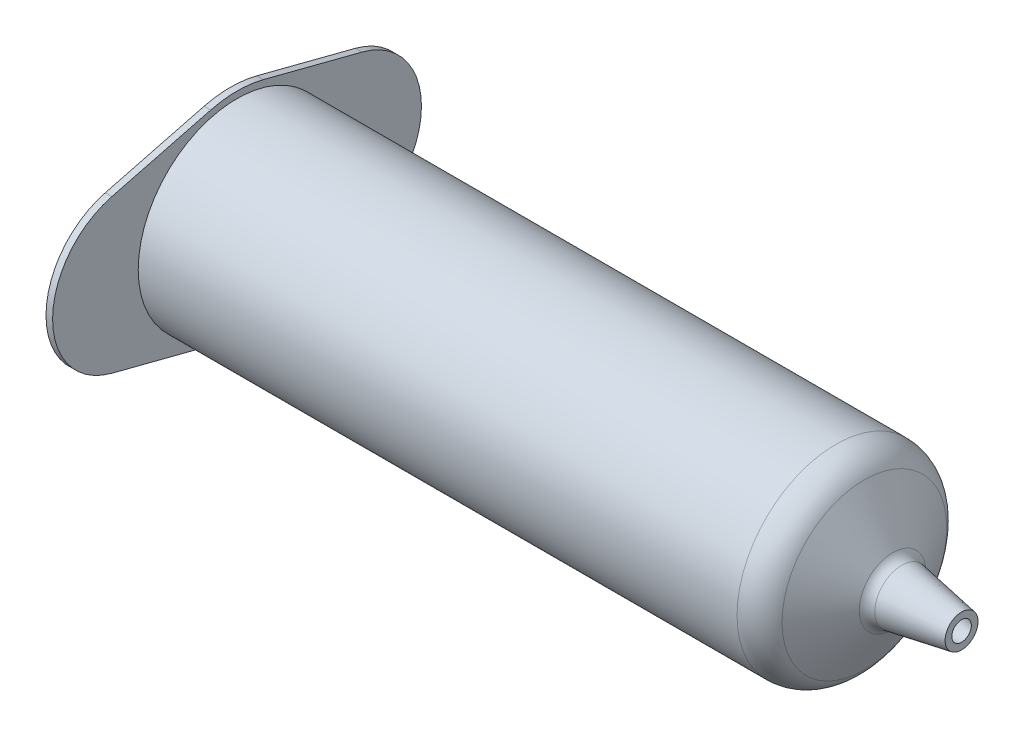
ISO-10303-21;
HEADER;
FILE_DESCRIPTION(('STEP AP214'),'2;1');
FILE_NAME('part.step','',(''),(''),'','','');
FILE_SCHEMA(('AUTOMOTIVE_DESIGN { 1 0 10303 214 1 1 1 1 }'));
ENDSEC;
DATA;
#1=APPLICATION_CONTEXT('core data for automotive mechanical design processes');
#2=APPLICATION_PROTOCOL_DEFINITION('international standard','automotive_design',2000,#1);
#3=PRODUCT_CONTEXT('',#1,'mechanical');
#4=PRODUCT('Part','Part','',(#3));
#5=PRODUCT_RELATED_PRODUCT_CATEGORY('part','',(#4));
#6=PRODUCT_DEFINITION_FORMATION('','',#4);
#7=PRODUCT_DEFINITION_CONTEXT('part definition',#1,'design');
#8=PRODUCT_DEFINITION('design','',#6,#7);
#9=PRODUCT_DEFINITION_SHAPE('','',#8);
#10=(LENGTH_UNIT() NAMED_UNIT(*) SI_UNIT(.MILLI.,.METRE.));
#11=(NAMED_UNIT(*) PLANE_ANGLE_UNIT() SI_UNIT($,.RADIAN.));
#12=(NAMED_UNIT(*) SI_UNIT($,.STERADIAN.) SOLID_ANGLE_UNIT());
#13=UNCERTAINTY_MEASURE_WITH_UNIT(LENGTH_MEASURE(1.E-05),#10,'distance_accuracy_value','');
#14=(GEOMETRIC_REPRESENTATION_CONTEXT(3) GLOBAL_UNCERTAINTY_ASSIGNED_CONTEXT((#13)) GLOBAL_UNIT_ASSIGNED_CONTEXT((#10,
#11,#12)) REPRESENTATION_CONTEXT('',''));
#15=CARTESIAN_POINT('',(0.,0.,0.));
#16=DIRECTION('',(0.,0.,1.));
#17=DIRECTION('',(1.,0.,0.));
#18=AXIS2_PLACEMENT_3D('',#15,#16,#17);
#19=CARTESIAN_POINT('',(11.5,70.,59.6966991411007));
#20=DIRECTION('',(-1.,0.,0.));
#21=DIRECTION('',(0.,0.,1.));
#22=AXIS2_PLACEMENT_3D('',#19,#20,#21);
#23=CYLINDRICAL_SURFACE('',#22,15.);
#24=CARTESIAN_POINT('',(102.414394586956,70.,59.6966991411007));
#25=DIRECTION('',(1.,0.,0.));
#26=DIRECTION('',(0.,0.,-1.));
#27=AXIS2_PLACEMENT_3D('',#24,#25,#26);
#28=CIRCLE('',#27,15.);
#29=CARTESIAN_POINT('',(102.414394586956,70.,44.6966991411007));
#30=VERTEX_POINT('',#29);
#31=EDGE_CURVE('E227',#30,#30,#28,.F.);
#32=ORIENTED_EDGE('',*,*,#31,.T.);
#33=EDGE_LOOP('',(#32));
#34=FACE_BOUND('',#33,.T.);
#35=CARTESIAN_POINT('',(11.5,70.,59.6966991411007));
#36=DIRECTION('',(-1.,0.,0.));
#37=DIRECTION('',(0.,0.,1.));
#38=AXIS2_PLACEMENT_3D('',#35,#36,#37);
#39=CIRCLE('',#38,15.);
#40=CARTESIAN_POINT('',(11.5,70.,74.6966991411007));
#41=VERTEX_POINT('',#40);
#42=EDGE_CURVE('E224',#41,#41,#39,.T.);
#43=ORIENTED_EDGE('',*,*,#42,.F.);
#44=EDGE_LOOP('',(#43));
#45=FACE_BOUND('',#44,.T.);
#46=ADVANCED_FACE('F77',(#34,#45),#23,.T.);
#47=CARTESIAN_POINT('',(111.5,70.,59.6966991411007));
#48=DIRECTION('',(-1.,0.,0.));
#49=DIRECTION('',(0.,0.,1.));
#50=AXIS2_PLACEMENT_3D('',#47,#48,#49);
#51=CONICAL_SURFACE('',#50,4.26326980708461,1.0471975511966);
#52=CARTESIAN_POINT('',(111.033692341845,70.,59.6966991411007));
#53=DIRECTION('',(-1.,0.,0.));
#54=DIRECTION('',(0.,0.,1.));
#55=AXIS2_PLACEMENT_3D('',#52,#53,#54);
#56=CIRCLE('',#55,5.07093836296753);
#57=CARTESIAN_POINT('',(111.033692341845,70.,64.7676375040682));
#58=VERTEX_POINT('',#57);
#59=EDGE_CURVE('E86',#58,#58,#56,.T.);
#60=ORIENTED_EDGE('',*,*,#59,.T.);
#61=EDGE_LOOP('',(#60));
#62=FACE_BOUND('',#61,.T.);
#63=CARTESIAN_POINT('',(106.744521605878,70.,59.6966991411007));
#64=DIRECTION('',(1.,0.,0.));
#65=DIRECTION('',(0.,0.,-1.));
#66=AXIS2_PLACEMENT_3D('',#63,#64,#65);
#67=CIRCLE('',#66,12.5);
#68=CARTESIAN_POINT('',(106.744521605878,70.,47.1966991411007));
#69=VERTEX_POINT('',#68);
#70=EDGE_CURVE('E230',#69,#69,#67,.T.);
#71=ORIENTED_EDGE('',*,*,#70,.T.);
#72=EDGE_LOOP('',(#71));
#73=FACE_BOUND('',#72,.T.);
#74=ADVANCED_FACE('F235',(#62,#73),#51,.T.);
#75=CARTESIAN_POINT('',(121.5,70.,59.6966991411007));
#76=DIRECTION('',(-1.,0.,0.));
#77=DIRECTION('',(0.,0.,1.));
#78=AXIS2_PLACEMENT_3D('',#75,#76,#77);
#79=CONICAL_SURFACE('',#78,2.5,0.174532925199429);
#80=CARTESIAN_POINT('',(112.41844679408,70.,59.6966991411007));
#81=DIRECTION('',(-1.,0.,0.));
#82=DIRECTION('',(0.,0.,1.));
#83=AXIS2_PLACEMENT_3D('',#80,#81,#82);
#84=CIRCLE('',#83,4.10132285694311);
#85=CARTESIAN_POINT('',(112.41844679408,70.,63.7980219980438));
#86=VERTEX_POINT('',#85);
#87=EDGE_CURVE('E13',#86,#86,#84,.F.);
#88=ORIENTED_EDGE('',*,*,#87,.T.);
#89=EDGE_LOOP('',(#88));
#90=FACE_BOUND('',#89,.T.);
#91=CARTESIAN_POINT('',(121.5,70.,59.6966991411007));
#92=DIRECTION('',(-1.,0.,0.));
#93=DIRECTION('',(0.,0.,1.));
#94=AXIS2_PLACEMENT_3D('',#91,#92,#93);
#95=CIRCLE('',#94,2.5);
#96=CARTESIAN_POINT('',(121.5,70.,62.1966991411007));
#97=VERTEX_POINT('',#96);
#98=EDGE_CURVE('E219',#97,#97,#95,.T.);
#99=ORIENTED_EDGE('',*,*,#98,.T.);
#100=EDGE_LOOP('',(#99));
#101=FACE_BOUND('',#100,.T.);
#102=ADVANCED_FACE('F258',(#90,#101),#79,.T.);
#103=CARTESIAN_POINT('',(121.5,72.5,59.6966991411007));
#104=DIRECTION('',(-1.,0.,0.));
#105=DIRECTION('',(0.,0.,1.));
#106=AXIS2_PLACEMENT_3D('',#103,#104,#105);
#107=PLANE('',#106);
#108=CARTESIAN_POINT('',(121.5,70.,59.6966991411007));
#109=DIRECTION('',(-1.,0.,0.));
#110=DIRECTION('',(0.,0.,1.));
#111=AXIS2_PLACEMENT_3D('',#108,#109,#110);
#112=CIRCLE('',#111,1.48457338811426);
#113=CARTESIAN_POINT('',(121.5,70.,61.1812725292149));
#114=VERTEX_POINT('',#113);
#115=EDGE_CURVE('E206',#114,#114,#112,.T.);
#116=ORIENTED_EDGE('',*,*,#115,.T.);
#117=EDGE_LOOP('',(#116));
#118=FACE_BOUND('',#117,.T.);
#119=ORIENTED_EDGE('',*,*,#98,.F.);
#120=EDGE_LOOP('',(#119));
#121=FACE_BOUND('',#120,.T.);
#122=ADVANCED_FACE('F249',(#118,#121),#107,.F.);
#123=CARTESIAN_POINT('',(102.414394586956,70.,59.6966991411007));
#124=DIRECTION('',(1.,0.,0.));
#125=DIRECTION('',(0.,0.,-1.));
#126=AXIS2_PLACEMENT_3D('',#123,#124,#125);
#127=TOROIDAL_SURFACE('',#126,10.,5.);
#128=ORIENTED_EDGE('',*,*,#70,.F.);
#129=EDGE_LOOP('',(#128));
#130=FACE_BOUND('',#129,.T.);
#131=ORIENTED_EDGE('',*,*,#31,.F.);
#132=EDGE_LOOP('',(#131));
#133=FACE_BOUND('',#132,.T.);
#134=ADVANCED_FACE('F240',(#130,#133),#127,.T.);
#135=CARTESIAN_POINT('',(112.765743149414,70.,59.6966991411007));
#136=DIRECTION('',(-1.,0.,0.));
#137=DIRECTION('',(0.,0.,1.));
#138=AXIS2_PLACEMENT_3D('',#135,#136,#137);
#139=TOROIDAL_SURFACE('',#138,6.07093836296754,2.);
#140=ORIENTED_EDGE('',*,*,#87,.F.);
#141=EDGE_LOOP('',(#140));
#142=FACE_BOUND('',#141,.T.);
#143=ORIENTED_EDGE('',*,*,#59,.F.);
#144=EDGE_LOOP('',(#143));
#145=FACE_BOUND('',#144,.T.);
#146=ADVANCED_FACE('F79',(#142,#145),#139,.F.);
#147=CARTESIAN_POINT('',(11.5,70.,59.6966991411007));
#148=DIRECTION('',(-1.,0.,0.));
#149=DIRECTION('',(0.,0.,1.));
#150=AXIS2_PLACEMENT_3D('',#147,#148,#149);
#151=CYLINDRICAL_SURFACE('',#150,14.);
#152=CARTESIAN_POINT('',(102.414394586956,70.,59.6966991411007));
#153=DIRECTION('',(-1.,0.,0.));
#154=DIRECTION('',(0.,0.,1.));
#155=AXIS2_PLACEMENT_3D('',#152,#153,#154);
#156=CIRCLE('',#155,14.);
#157=CARTESIAN_POINT('',(102.414394586956,70.,73.6966991411007));
#158=VERTEX_POINT('',#157);
#159=EDGE_CURVE('E207',#158,#158,#156,.T.);
#160=ORIENTED_EDGE('',*,*,#159,.F.);
#161=EDGE_LOOP('',(#160));
#162=FACE_BOUND('',#161,.T.);
#163=CARTESIAN_POINT('',(10.5,70.,59.6966991411007));
#164=DIRECTION('',(-1.,0.,0.));
#165=DIRECTION('',(0.,0.,1.));
#166=AXIS2_PLACEMENT_3D('',#163,#164,#165);
#167=CIRCLE('',#166,14.);
#168=CARTESIAN_POINT('',(10.5,70.,73.6966991411007));
#169=VERTEX_POINT('',#168);
#170=EDGE_CURVE('E180',#169,#169,#167,.T.);
#171=ORIENTED_EDGE('',*,*,#170,.T.);
#172=EDGE_LOOP('',(#171));
#173=FACE_BOUND('',#172,.T.);
#174=ADVANCED_FACE('F239',(#162,#173),#151,.F.);
#175=CARTESIAN_POINT('',(110.633974596216,70.,59.6966991411007));
#176=DIRECTION('',(-1.,0.,0.));
#177=DIRECTION('',(0.,0.,1.));
#178=AXIS2_PLACEMENT_3D('',#175,#176,#177);
#179=CONICAL_SURFACE('',#178,3.76326980708461,1.0471975511966);
#180=CARTESIAN_POINT('',(110.167666938061,70.,59.6966991411007));
#181=DIRECTION('',(-1.,0.,0.));
#182=DIRECTION('',(0.,0.,1.));
#183=AXIS2_PLACEMENT_3D('',#180,#181,#182);
#184=CIRCLE('',#183,4.57093836296753);
#185=CARTESIAN_POINT('',(110.167666938061,70.,64.2676375040682));
#186=VERTEX_POINT('',#185);
#187=EDGE_CURVE('E213',#186,#186,#184,.T.);
#188=ORIENTED_EDGE('',*,*,#187,.F.);
#189=EDGE_LOOP('',(#188));
#190=FACE_BOUND('',#189,.T.);
#191=CARTESIAN_POINT('',(105.878496202094,70.,59.6966991411007));
#192=DIRECTION('',(-1.,0.,0.));
#193=DIRECTION('',(0.,0.,1.));
#194=AXIS2_PLACEMENT_3D('',#191,#192,#193);
#195=CIRCLE('',#194,12.);
#196=CARTESIAN_POINT('',(105.878496202094,70.,71.6966991411007));
#197=VERTEX_POINT('',#196);
#198=EDGE_CURVE('E210',#197,#197,#195,.F.);
#199=ORIENTED_EDGE('',*,*,#198,.F.);
#200=EDGE_LOOP('',(#199));
#201=FACE_BOUND('',#200,.T.);
#202=ADVANCED_FACE('F246',(#190,#201),#179,.F.);
#203=CARTESIAN_POINT('',(121.326351822333,70.,59.6966991411007));
#204=DIRECTION('',(-1.,0.,0.));
#205=DIRECTION('',(0.,0.,1.));
#206=AXIS2_PLACEMENT_3D('',#203,#204,#205);
#207=CONICAL_SURFACE('',#206,1.51519224698779,0.174532925199429);
#208=CARTESIAN_POINT('',(112.244798616413,70.,59.6966991411007));
#209=DIRECTION('',(-1.,0.,0.));
#210=DIRECTION('',(0.,0.,1.));
#211=AXIS2_PLACEMENT_3D('',#208,#209,#210);
#212=CIRCLE('',#211,3.1165151039309);
#213=CARTESIAN_POINT('',(112.244798616413,70.,62.8132142450316));
#214=VERTEX_POINT('',#213);
#215=EDGE_CURVE('E216',#214,#214,#212,.F.);
#216=ORIENTED_EDGE('',*,*,#215,.F.);
#217=EDGE_LOOP('',(#216));
#218=FACE_BOUND('',#217,.T.);
#219=ORIENTED_EDGE('',*,*,#115,.F.);
#220=EDGE_LOOP('',(#219));
#221=FACE_BOUND('',#220,.T.);
#222=ADVANCED_FACE('F276',(#218,#221),#207,.F.);
#223=CARTESIAN_POINT('',(102.414394586956,70.,59.6966991411007));
#224=DIRECTION('',(1.,0.,0.));
#225=DIRECTION('',(0.,0.,-1.));
#226=AXIS2_PLACEMENT_3D('',#223,#224,#225);
#227=TOROIDAL_SURFACE('',#226,10.,4.);
#228=ORIENTED_EDGE('',*,*,#198,.T.);
#229=EDGE_LOOP('',(#228));
#230=FACE_BOUND('',#229,.T.);
#231=ORIENTED_EDGE('',*,*,#159,.T.);
#232=EDGE_LOOP('',(#231));
#233=FACE_BOUND('',#232,.T.);
#234=ADVANCED_FACE('F272',(#230,#233),#227,.F.);
#235=CARTESIAN_POINT('',(112.765743149414,70.,59.6966991411007));
#236=DIRECTION('',(-1.,0.,0.));
#237=DIRECTION('',(0.,0.,1.));
#238=AXIS2_PLACEMENT_3D('',#235,#236,#237);
#239=TOROIDAL_SURFACE('',#238,6.07093836296754,3.);
#240=ORIENTED_EDGE('',*,*,#215,.T.);
#241=EDGE_LOOP('',(#240));
#242=FACE_BOUND('',#241,.T.);
#243=ORIENTED_EDGE('',*,*,#187,.T.);
#244=EDGE_LOOP('',(#243));
#245=FACE_BOUND('',#244,.T.);
#246=ADVANCED_FACE('F268',(#242,#245),#239,.T.);
#247=CARTESIAN_POINT('',(11.5,70.,75.6966991411007));
#248=DIRECTION('',(-1.,0.,0.));
#249=DIRECTION('',(0.,0.,1.));
#250=AXIS2_PLACEMENT_3D('',#247,#248,#249);
#251=PLANE('',#250);
#252=CARTESIAN_POINT('',(11.5,70.,75.6966991411007));
#253=DIRECTION('',(-1.,0.,0.));
#254=DIRECTION('',(0.,0.,1.));
#255=AXIS2_PLACEMENT_3D('',#252,#253,#254);
#256=CIRCLE('',#255,12.);
#257=CARTESIAN_POINT('',(11.5,58.3810499613777,78.6966991411007));
#258=VERTEX_POINT('',#257);
#259=CARTESIAN_POINT('',(11.5,81.6189500386222,78.6966991411007));
#260=VERTEX_POINT('',#259);
#261=EDGE_CURVE('E176',#258,#260,#256,.T.);
#262=ORIENTED_EDGE('',*,*,#261,.F.);
#263=DIRECTION('',(0.,0.25,0.968245836551854));
#264=VECTOR('',#263,1.);
#265=CARTESIAN_POINT('',(11.5,54.5080666151703,63.6966991411007));
#266=LINE('',#265,#264);
#267=CARTESIAN_POINT('',(11.5,54.5080666151703,63.6966991411007));
#268=VERTEX_POINT('',#267);
#269=EDGE_CURVE('E129',#268,#258,#266,.T.);
#270=ORIENTED_EDGE('',*,*,#269,.F.);
#271=CARTESIAN_POINT('',(11.5,70.,59.6966991411007));
#272=DIRECTION('',(-1.,0.,0.));
#273=DIRECTION('',(0.,0.,-1.));
#274=AXIS2_PLACEMENT_3D('',#271,#272,#273);
#275=CIRCLE('',#274,16.);
#276=CARTESIAN_POINT('',(11.5,54.5080666151703,55.6966991411007));
#277=VERTEX_POINT('',#276);
#278=EDGE_CURVE('E123',#277,#268,#275,.T.);
#279=ORIENTED_EDGE('',*,*,#278,.F.);
#280=DIRECTION('',(0.,-0.25,0.968245836551854));
#281=VECTOR('',#280,1.);
#282=CARTESIAN_POINT('',(11.5,54.5080666151703,55.6966991411007));
#283=LINE('',#282,#281);
#284=CARTESIAN_POINT('',(11.5,58.3810499613777,40.6966991411007));
#285=VERTEX_POINT('',#284);
#286=EDGE_CURVE('E166',#285,#277,#283,.T.);
#287=ORIENTED_EDGE('',*,*,#286,.F.);
#288=CARTESIAN_POINT('',(11.5,70.,43.6966991411007));
#289=DIRECTION('',(-1.,0.,0.));
#290=DIRECTION('',(0.,0.,1.));
#291=AXIS2_PLACEMENT_3D('',#288,#289,#290);
#292=CIRCLE('',#291,12.);
#293=CARTESIAN_POINT('',(11.5,81.6189500386222,40.6966991411007));
#294=VERTEX_POINT('',#293);
#295=EDGE_CURVE('E186',#294,#285,#292,.T.);
#296=ORIENTED_EDGE('',*,*,#295,.F.);
#297=DIRECTION('',(0.,-0.25,-0.968245836551854));
#298=VECTOR('',#297,1.);
#299=CARTESIAN_POINT('',(11.5,85.4919333848297,55.6966991411007));
#300=LINE('',#299,#298);
#301=CARTESIAN_POINT('',(11.5,85.4919333848297,55.6966991411007));
#302=VERTEX_POINT('',#301);
#303=EDGE_CURVE('E184',#302,#294,#300,.T.);
#304=ORIENTED_EDGE('',*,*,#303,.F.);
#305=CARTESIAN_POINT('',(11.5,70.,59.6966991411007));
#306=DIRECTION('',(-1.,0.,0.));
#307=DIRECTION('',(0.,0.,1.));
#308=AXIS2_PLACEMENT_3D('',#305,#306,#307);
#309=CIRCLE('',#308,16.);
#310=CARTESIAN_POINT('',(11.5,85.4919333848297,63.6966991411007));
#311=VERTEX_POINT('',#310);
#312=EDGE_CURVE('E182',#311,#302,#309,.T.);
#313=ORIENTED_EDGE('',*,*,#312,.F.);
#314=DIRECTION('',(0.,0.25,-0.968245836551854));
#315=VECTOR('',#314,1.);
#316=CARTESIAN_POINT('',(11.5,85.4919333848297,63.6966991411007));
#317=LINE('',#316,#315);
#318=EDGE_CURVE('E179',#260,#311,#317,.T.);
#319=ORIENTED_EDGE('',*,*,#318,.F.);
#320=EDGE_LOOP('',(#262,#270,#279,#287,#296,#304,#313,#319));
#321=FACE_BOUND('',#320,.T.);
#322=ORIENTED_EDGE('',*,*,#42,.T.);
#323=EDGE_LOOP('',(#322));
#324=FACE_BOUND('',#323,.T.);
#325=ADVANCED_FACE('F271',(#321,#324),#251,.F.);
#326=CARTESIAN_POINT('',(10.5,70.,75.6966991411007));
#327=DIRECTION('',(-1.,0.,0.));
#328=DIRECTION('',(0.,0.,1.));
#329=AXIS2_PLACEMENT_3D('',#326,#327,#328);
#330=PLANE('',#329);
#331=CARTESIAN_POINT('',(10.5,70.,75.6966991411007));
#332=DIRECTION('',(-1.,0.,0.));
#333=DIRECTION('',(0.,0.,1.));
#334=AXIS2_PLACEMENT_3D('',#331,#332,#333);
#335=CIRCLE('',#334,12.);
#336=CARTESIAN_POINT('',(10.5,58.3810499613777,78.6966991411007));
#337=VERTEX_POINT('',#336);
#338=CARTESIAN_POINT('',(10.5,81.6189500386222,78.6966991411007));
#339=VERTEX_POINT('',#338);
#340=EDGE_CURVE('E191',#337,#339,#335,.T.);
#341=ORIENTED_EDGE('',*,*,#340,.T.);
#342=DIRECTION('',(0.,0.25,-0.968245836551854));
#343=VECTOR('',#342,1.);
#344=CARTESIAN_POINT('',(10.5,85.4919333848297,63.6966991411007));
#345=LINE('',#344,#343);
#346=CARTESIAN_POINT('',(10.5,85.4919333848297,63.6966991411007));
#347=VERTEX_POINT('',#346);
#348=EDGE_CURVE('E138',#339,#347,#345,.T.);
#349=ORIENTED_EDGE('',*,*,#348,.T.);
#350=CARTESIAN_POINT('',(10.5,70.,59.6966991411007));
#351=DIRECTION('',(-1.,0.,0.));
#352=DIRECTION('',(0.,0.,1.));
#353=AXIS2_PLACEMENT_3D('',#350,#351,#352);
#354=CIRCLE('',#353,16.);
#355=CARTESIAN_POINT('',(10.5,85.4919333848297,55.6966991411007));
#356=VERTEX_POINT('',#355);
#357=EDGE_CURVE('E446',#347,#356,#354,.T.);
#358=ORIENTED_EDGE('',*,*,#357,.T.);
#359=DIRECTION('',(0.,-0.25,-0.968245836551854));
#360=VECTOR('',#359,1.);
#361=CARTESIAN_POINT('',(10.5,85.4919333848297,55.6966991411007));
#362=LINE('',#361,#360);
#363=CARTESIAN_POINT('',(10.5,81.6189500386222,40.6966991411007));
#364=VERTEX_POINT('',#363);
#365=EDGE_CURVE('E451',#356,#364,#362,.T.);
#366=ORIENTED_EDGE('',*,*,#365,.T.);
#367=CARTESIAN_POINT('',(10.5,70.,43.6966991411007));
#368=DIRECTION('',(-1.,0.,0.));
#369=DIRECTION('',(0.,0.,1.));
#370=AXIS2_PLACEMENT_3D('',#367,#368,#369);
#371=CIRCLE('',#370,12.);
#372=CARTESIAN_POINT('',(10.5,58.3810499613777,40.6966991411007));
#373=VERTEX_POINT('',#372);
#374=EDGE_CURVE('E158',#364,#373,#371,.T.);
#375=ORIENTED_EDGE('',*,*,#374,.T.);
#376=DIRECTION('',(0.,-0.25,0.968245836551854));
#377=VECTOR('',#376,1.);
#378=CARTESIAN_POINT('',(10.5,54.5080666151703,55.6966991411007));
#379=LINE('',#378,#377);
#380=CARTESIAN_POINT('',(10.5,54.5080666151703,55.6966991411007));
#381=VERTEX_POINT('',#380);
#382=EDGE_CURVE('E151',#373,#381,#379,.T.);
#383=ORIENTED_EDGE('',*,*,#382,.T.);
#384=CARTESIAN_POINT('',(10.5,70.,59.6966991411007));
#385=DIRECTION('',(-1.,0.,0.));
#386=DIRECTION('',(0.,0.,-1.));
#387=AXIS2_PLACEMENT_3D('',#384,#385,#386);
#388=CIRCLE('',#387,16.);
#389=CARTESIAN_POINT('',(10.5,54.5080666151703,63.6966991411007));
#390=VERTEX_POINT('',#389);
#391=EDGE_CURVE('E156',#381,#390,#388,.T.);
#392=ORIENTED_EDGE('',*,*,#391,.T.);
#393=DIRECTION('',(0.,0.25,0.968245836551854));
#394=VECTOR('',#393,1.);
#395=CARTESIAN_POINT('',(10.5,54.5080666151703,63.6966991411007));
#396=LINE('',#395,#394);
#397=EDGE_CURVE('E94',#390,#337,#396,.T.);
#398=ORIENTED_EDGE('',*,*,#397,.T.);
#399=EDGE_LOOP('',(#341,#349,#358,#366,#375,#383,#392,#398));
#400=FACE_BOUND('',#399,.T.);
#401=ORIENTED_EDGE('',*,*,#170,.F.);
#402=EDGE_LOOP('',(#401));
#403=FACE_BOUND('',#402,.T.);
#404=ADVANCED_FACE('F153',(#400,#403),#330,.T.);
#405=CARTESIAN_POINT('',(10.5,70.,75.6966991411007));
#406=DIRECTION('',(1.,0.,0.));
#407=DIRECTION('',(0.,0.,-1.));
#408=AXIS2_PLACEMENT_3D('',#405,#406,#407);
#409=CYLINDRICAL_SURFACE('',#408,12.);
#410=ORIENTED_EDGE('',*,*,#261,.T.);
#411=DIRECTION('',(1.,0.,0.));
#412=VECTOR('',#411,1.);
#413=CARTESIAN_POINT('',(10.5,81.6189500386222,78.6966991411007));
#414=LINE('',#413,#412);
#415=EDGE_CURVE('E204',#339,#260,#414,.T.);
#416=ORIENTED_EDGE('',*,*,#415,.F.);
#417=ORIENTED_EDGE('',*,*,#340,.F.);
#418=DIRECTION('',(1.,0.,0.));
#419=VECTOR('',#418,1.);
#420=CARTESIAN_POINT('',(10.5,58.3810499613777,78.6966991411007));
#421=LINE('',#420,#419);
#422=EDGE_CURVE('E172',#337,#258,#421,.T.);
#423=ORIENTED_EDGE('',*,*,#422,.T.);
#424=EDGE_LOOP('',(#410,#416,#417,#423));
#425=FACE_BOUND('',#424,.T.);
#426=ADVANCED_FACE('F284',(#425),#409,.T.);
#427=CARTESIAN_POINT('',(10.5,85.4919333848297,63.6966991411007));
#428=DIRECTION('',(0.,-0.968245836551854,-0.25));
#429=DIRECTION('',(0.,0.25,-0.968245836551854));
#430=AXIS2_PLACEMENT_3D('',#427,#428,#429);
#431=PLANE('',#430);
#432=ORIENTED_EDGE('',*,*,#318,.T.);
#433=DIRECTION('',(1.,0.,0.));
#434=VECTOR('',#433,1.);
#435=CARTESIAN_POINT('',(10.5,85.4919333848297,63.6966991411007));
#436=LINE('',#435,#434);
#437=EDGE_CURVE('E201',#347,#311,#436,.T.);
#438=ORIENTED_EDGE('',*,*,#437,.F.);
#439=ORIENTED_EDGE('',*,*,#348,.F.);
#440=ORIENTED_EDGE('',*,*,#415,.T.);
#441=EDGE_LOOP('',(#432,#438,#439,#440));
#442=FACE_BOUND('',#441,.T.);
#443=ADVANCED_FACE('F287',(#442),#431,.F.);
#444=CARTESIAN_POINT('',(10.5,70.,59.6966991411007));
#445=DIRECTION('',(1.,0.,0.));
#446=DIRECTION('',(0.,0.,-1.));
#447=AXIS2_PLACEMENT_3D('',#444,#445,#446);
#448=CYLINDRICAL_SURFACE('',#447,16.);
#449=ORIENTED_EDGE('',*,*,#312,.T.);
#450=DIRECTION('',(1.,0.,0.));
#451=VECTOR('',#450,1.);
#452=CARTESIAN_POINT('',(10.5,85.4919333848297,55.6966991411007));
#453=LINE('',#452,#451);
#454=EDGE_CURVE('E198',#356,#302,#453,.T.);
#455=ORIENTED_EDGE('',*,*,#454,.F.);
#456=ORIENTED_EDGE('',*,*,#357,.F.);
#457=ORIENTED_EDGE('',*,*,#437,.T.);
#458=EDGE_LOOP('',(#449,#455,#456,#457));
#459=FACE_BOUND('',#458,.T.);
#460=ADVANCED_FACE('F291',(#459),#448,.T.);
#461=CARTESIAN_POINT('',(10.5,85.4919333848297,55.6966991411007));
#462=DIRECTION('',(0.,-0.968245836551854,0.25));
#463=DIRECTION('',(0.,-0.25,-0.968245836551854));
#464=AXIS2_PLACEMENT_3D('',#461,#462,#463);
#465=PLANE('',#464);
#466=ORIENTED_EDGE('',*,*,#303,.T.);
#467=DIRECTION('',(1.,0.,0.));
#468=VECTOR('',#467,1.);
#469=CARTESIAN_POINT('',(10.5,81.6189500386222,40.6966991411007));
#470=LINE('',#469,#468);
#471=EDGE_CURVE('E195',#364,#294,#470,.T.);
#472=ORIENTED_EDGE('',*,*,#471,.F.);
#473=ORIENTED_EDGE('',*,*,#365,.F.);
#474=ORIENTED_EDGE('',*,*,#454,.T.);
#475=EDGE_LOOP('',(#466,#472,#473,#474));
#476=FACE_BOUND('',#475,.T.);
#477=ADVANCED_FACE('F294',(#476),#465,.F.);
#478=CARTESIAN_POINT('',(10.5,70.,43.6966991411007));
#479=DIRECTION('',(1.,0.,0.));
#480=DIRECTION('',(0.,0.,-1.));
#481=AXIS2_PLACEMENT_3D('',#478,#479,#480);
#482=CYLINDRICAL_SURFACE('',#481,12.);
#483=ORIENTED_EDGE('',*,*,#295,.T.);
#484=DIRECTION('',(1.,0.,0.));
#485=VECTOR('',#484,1.);
#486=CARTESIAN_POINT('',(10.5,58.3810499613777,40.6966991411007));
#487=LINE('',#486,#485);
#488=EDGE_CURVE('E167',#373,#285,#487,.T.);
#489=ORIENTED_EDGE('',*,*,#488,.F.);
#490=ORIENTED_EDGE('',*,*,#374,.F.);
#491=ORIENTED_EDGE('',*,*,#471,.T.);
#492=EDGE_LOOP('',(#483,#489,#490,#491));
#493=FACE_BOUND('',#492,.T.);
#494=ADVANCED_FACE('F298',(#493),#482,.T.);
#495=CARTESIAN_POINT('',(10.5,54.5080666151703,55.6966991411007));
#496=DIRECTION('',(0.,0.968245836551854,0.25));
#497=DIRECTION('',(0.,-0.25,0.968245836551854));
#498=AXIS2_PLACEMENT_3D('',#495,#496,#497);
#499=PLANE('',#498);
#500=ORIENTED_EDGE('',*,*,#286,.T.);
#501=DIRECTION('',(1.,0.,0.));
#502=VECTOR('',#501,1.);
#503=CARTESIAN_POINT('',(10.5,54.5080666151703,55.6966991411007));
#504=LINE('',#503,#502);
#505=EDGE_CURVE('E163',#381,#277,#504,.T.);
#506=ORIENTED_EDGE('',*,*,#505,.F.);
#507=ORIENTED_EDGE('',*,*,#382,.F.);
#508=ORIENTED_EDGE('',*,*,#488,.T.);
#509=EDGE_LOOP('',(#500,#506,#507,#508));
#510=FACE_BOUND('',#509,.T.);
#511=ADVANCED_FACE('F164',(#510),#499,.F.);
#512=CARTESIAN_POINT('',(10.5,70.,59.6966991411007));
#513=DIRECTION('',(1.,0.,0.));
#514=DIRECTION('',(0.,0.,-1.));
#515=AXIS2_PLACEMENT_3D('',#512,#513,#514);
#516=CYLINDRICAL_SURFACE('',#515,16.);
#517=ORIENTED_EDGE('',*,*,#278,.T.);
#518=DIRECTION('',(1.,0.,0.));
#519=VECTOR('',#518,1.);
#520=CARTESIAN_POINT('',(10.5,54.5080666151703,63.6966991411007));
#521=LINE('',#520,#519);
#522=EDGE_CURVE('E168',#390,#268,#521,.T.);
#523=ORIENTED_EDGE('',*,*,#522,.F.);
#524=ORIENTED_EDGE('',*,*,#391,.F.);
#525=ORIENTED_EDGE('',*,*,#505,.T.);
#526=EDGE_LOOP('',(#517,#523,#524,#525));
#527=FACE_BOUND('',#526,.T.);
#528=ADVANCED_FACE('F170',(#527),#516,.T.);
#529=CARTESIAN_POINT('',(10.5,54.5080666151703,63.6966991411007));
#530=DIRECTION('',(0.,0.968245836551854,-0.25));
#531=DIRECTION('',(0.,0.25,0.968245836551854));
#532=AXIS2_PLACEMENT_3D('',#529,#530,#531);
#533=PLANE('',#532);
#534=ORIENTED_EDGE('',*,*,#269,.T.);
#535=ORIENTED_EDGE('',*,*,#422,.F.);
#536=ORIENTED_EDGE('',*,*,#397,.F.);
#537=ORIENTED_EDGE('',*,*,#522,.T.);
#538=EDGE_LOOP('',(#534,#535,#536,#537));
#539=FACE_BOUND('',#538,.T.);
#540=ADVANCED_FACE('F307',(#539),#533,.F.);
#541=CLOSED_SHELL('',(#46,#74,#102,#122,#134,#146,#174,#202,#222,#234,#246,#325,#404,#426,#443,
#460,#477,#494,#511,#528,#540));
#542=MANIFOLD_SOLID_BREP('B2',#541);
#543=ADVANCED_BREP_SHAPE_REPRESENTATION('',(#18,#542),#14);
#544=SHAPE_DEFINITION_REPRESENTATION(#9,#543);
ENDSEC;
END-ISO-10303-21;
